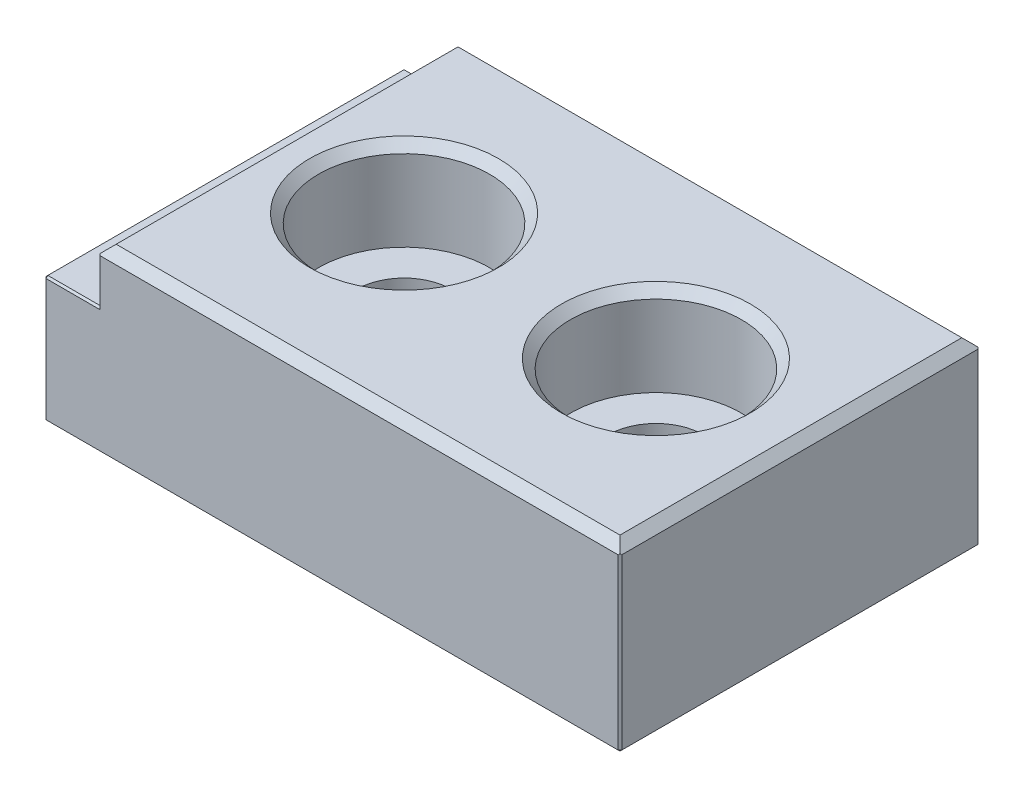
ISO-10303-21;
HEADER;
FILE_DESCRIPTION(('STEP AP214'),'2;1');
FILE_NAME('part.step','',(''),(''),'','','');
FILE_SCHEMA(('AUTOMOTIVE_DESIGN { 1 0 10303 214 1 1 1 1 }'));
ENDSEC;
DATA;
#1=APPLICATION_CONTEXT('core data for automotive mechanical design processes');
#2=APPLICATION_PROTOCOL_DEFINITION('international standard','automotive_design',2000,#1);
#3=PRODUCT_CONTEXT('',#1,'mechanical');
#4=PRODUCT('Part','Part','',(#3));
#5=PRODUCT_RELATED_PRODUCT_CATEGORY('part','',(#4));
#6=PRODUCT_DEFINITION_FORMATION('','',#4);
#7=PRODUCT_DEFINITION_CONTEXT('part definition',#1,'design');
#8=PRODUCT_DEFINITION('design','',#6,#7);
#9=PRODUCT_DEFINITION_SHAPE('','',#8);
#10=(LENGTH_UNIT() NAMED_UNIT(*) SI_UNIT(.MILLI.,.METRE.));
#11=(NAMED_UNIT(*) PLANE_ANGLE_UNIT() SI_UNIT($,.RADIAN.));
#12=(NAMED_UNIT(*) SI_UNIT($,.STERADIAN.) SOLID_ANGLE_UNIT());
#13=UNCERTAINTY_MEASURE_WITH_UNIT(LENGTH_MEASURE(1.E-05),#10,'distance_accuracy_value','');
#14=(GEOMETRIC_REPRESENTATION_CONTEXT(3) GLOBAL_UNCERTAINTY_ASSIGNED_CONTEXT((#13)) GLOBAL_UNIT_ASSIGNED_CONTEXT((#10,
#11,#12)) REPRESENTATION_CONTEXT('',''));
#15=CARTESIAN_POINT('',(0.,0.,0.));
#16=DIRECTION('',(0.,0.,1.));
#17=DIRECTION('',(1.,0.,0.));
#18=AXIS2_PLACEMENT_3D('',#15,#16,#17);
#19=CARTESIAN_POINT('',(0.,10.,0.));
#20=DIRECTION('',(0.,1.,0.));
#21=DIRECTION('',(0.,0.,1.));
#22=AXIS2_PLACEMENT_3D('',#19,#20,#21);
#23=PLANE('',#22);
#24=CARTESIAN_POINT('',(9.86640835579515,10.,-4.24999999999999));
#25=DIRECTION('',(0.,1.,0.));
#26=DIRECTION('',(0.,0.,1.));
#27=AXIS2_PLACEMENT_3D('',#24,#25,#26);
#28=CIRCLE('',#27,5.25000000000001);
#29=CARTESIAN_POINT('',(9.86640835579515,10.,1.00000000000002));
#30=VERTEX_POINT('',#29);
#31=EDGE_CURVE('E203',#30,#30,#28,.F.);
#32=ORIENTED_EDGE('',*,*,#31,.T.);
#33=EDGE_LOOP('',(#32));
#34=FACE_BOUND('',#33,.T.);
#35=CARTESIAN_POINT('',(-4.13359164420485,10.,-4.24999999999999));
#36=DIRECTION('',(0.,1.,0.));
#37=DIRECTION('',(0.,0.,1.));
#38=AXIS2_PLACEMENT_3D('',#35,#36,#37);
#39=CIRCLE('',#38,5.25000000000001);
#40=CARTESIAN_POINT('',(-4.13359164420485,10.,1.00000000000002));
#41=VERTEX_POINT('',#40);
#42=EDGE_CURVE('E200',#41,#41,#39,.F.);
#43=ORIENTED_EDGE('',*,*,#42,.T.);
#44=EDGE_LOOP('',(#43));
#45=FACE_BOUND('',#44,.T.);
#46=DIRECTION('',(-1.,0.,0.));
#47=VECTOR('',#46,1.);
#48=CARTESIAN_POINT('',(-11.1335916442048,10.,-13.75));
#49=LINE('',#48,#47);
#50=CARTESIAN_POINT('',(17.3664083557951,10.,-13.75));
#51=VERTEX_POINT('',#50);
#52=CARTESIAN_POINT('',(-10.6335916442048,10.,-13.75));
#53=VERTEX_POINT('',#52);
#54=EDGE_CURVE('E168',#51,#53,#49,.T.);
#55=ORIENTED_EDGE('',*,*,#54,.T.);
#56=DIRECTION('',(0.,0.,1.));
#57=VECTOR('',#56,1.);
#58=CARTESIAN_POINT('',(-10.6335916442048,10.,5.75000000000001));
#59=LINE('',#58,#57);
#60=CARTESIAN_POINT('',(-10.6335916442048,10.,5.25));
#61=VERTEX_POINT('',#60);
#62=EDGE_CURVE('E198',#53,#61,#59,.T.);
#63=ORIENTED_EDGE('',*,*,#62,.T.);
#64=DIRECTION('',(1.,0.,0.));
#65=VECTOR('',#64,1.);
#66=CARTESIAN_POINT('',(17.8664083557952,10.,5.25));
#67=LINE('',#66,#65);
#68=CARTESIAN_POINT('',(17.3664083557952,10.,5.25));
#69=VERTEX_POINT('',#68);
#70=EDGE_CURVE('E171',#61,#69,#67,.T.);
#71=ORIENTED_EDGE('',*,*,#70,.T.);
#72=DIRECTION('',(0.,0.,-1.));
#73=VECTOR('',#72,1.);
#74=CARTESIAN_POINT('',(17.3664083557951,10.,-14.25));
#75=LINE('',#74,#73);
#76=EDGE_CURVE('E164',#69,#51,#75,.T.);
#77=ORIENTED_EDGE('',*,*,#76,.T.);
#78=EDGE_LOOP('',(#55,#63,#71,#77));
#79=FACE_BOUND('',#78,.T.);
#80=ADVANCED_FACE('F33',(#34,#45,#79),#23,.T.);
#81=CARTESIAN_POINT('',(0.,0.,0.));
#82=DIRECTION('',(0.,1.,0.));
#83=DIRECTION('',(0.,0.,1.));
#84=AXIS2_PLACEMENT_3D('',#81,#82,#83);
#85=PLANE('',#84);
#86=CARTESIAN_POINT('',(-4.13359164420485,0.,-4.24999999999999));
#87=DIRECTION('',(0.,1.,0.));
#88=DIRECTION('',(0.,0.,1.));
#89=AXIS2_PLACEMENT_3D('',#86,#87,#88);
#90=CIRCLE('',#89,2.74999999999999);
#91=CARTESIAN_POINT('',(-4.13359164420485,0.,-1.5));
#92=VERTEX_POINT('',#91);
#93=EDGE_CURVE('E236',#92,#92,#90,.T.);
#94=ORIENTED_EDGE('',*,*,#93,.T.);
#95=EDGE_LOOP('',(#94));
#96=FACE_BOUND('',#95,.T.);
#97=CARTESIAN_POINT('',(9.86640835579515,0.,-4.24999999999999));
#98=DIRECTION('',(0.,1.,0.));
#99=DIRECTION('',(0.,0.,1.));
#100=AXIS2_PLACEMENT_3D('',#97,#98,#99);
#101=CIRCLE('',#100,2.74999999999999);
#102=CARTESIAN_POINT('',(9.86640835579515,0.,-1.5));
#103=VERTEX_POINT('',#102);
#104=EDGE_CURVE('E233',#103,#103,#101,.T.);
#105=ORIENTED_EDGE('',*,*,#104,.T.);
#106=EDGE_LOOP('',(#105));
#107=FACE_BOUND('',#106,.T.);
#108=DIRECTION('',(0.,0.,1.));
#109=VECTOR('',#108,1.);
#110=CARTESIAN_POINT('',(17.7664083557951,0.,0.));
#111=LINE('',#110,#109);
#112=CARTESIAN_POINT('',(17.7664083557951,0.,-14.15));
#113=VERTEX_POINT('',#112);
#114=CARTESIAN_POINT('',(17.7664083557952,0.,5.65000000000001));
#115=VERTEX_POINT('',#114);
#116=EDGE_CURVE('E220',#113,#115,#111,.T.);
#117=ORIENTED_EDGE('',*,*,#116,.T.);
#118=DIRECTION('',(-1.,0.,0.));
#119=VECTOR('',#118,1.);
#120=CARTESIAN_POINT('',(0.,0.,5.65000000000001));
#121=LINE('',#120,#119);
#122=CARTESIAN_POINT('',(-14.0335916442048,0.,5.65000000000001));
#123=VERTEX_POINT('',#122);
#124=EDGE_CURVE('E230',#115,#123,#121,.T.);
#125=ORIENTED_EDGE('',*,*,#124,.T.);
#126=DIRECTION('',(0.,0.,-1.));
#127=VECTOR('',#126,1.);
#128=CARTESIAN_POINT('',(-14.0335916442048,0.,0.));
#129=LINE('',#128,#127);
#130=CARTESIAN_POINT('',(-14.0335916442048,0.,-14.15));
#131=VERTEX_POINT('',#130);
#132=EDGE_CURVE('E228',#123,#131,#129,.T.);
#133=ORIENTED_EDGE('',*,*,#132,.T.);
#134=DIRECTION('',(1.,0.,0.));
#135=VECTOR('',#134,1.);
#136=CARTESIAN_POINT('',(0.,0.,-14.15));
#137=LINE('',#136,#135);
#138=EDGE_CURVE('E226',#131,#113,#137,.T.);
#139=ORIENTED_EDGE('',*,*,#138,.T.);
#140=EDGE_LOOP('',(#117,#125,#133,#139));
#141=FACE_BOUND('',#140,.T.);
#142=ADVANCED_FACE('F442',(#96,#107,#141),#85,.F.);
#143=CARTESIAN_POINT('',(-14.1335916442049,10.,-14.25));
#144=DIRECTION('',(1.,0.,0.));
#145=DIRECTION('',(0.,0.,-1.));
#146=AXIS2_PLACEMENT_3D('',#143,#144,#145);
#147=PLANE('',#146);
#148=DIRECTION('',(0.,0.,1.));
#149=VECTOR('',#148,1.);
#150=CARTESIAN_POINT('',(-14.1335916442049,0.100000000000003,-14.25));
#151=LINE('',#150,#149);
#152=CARTESIAN_POINT('',(-14.1335916442049,0.100000000000003,-14.15));
#153=VERTEX_POINT('',#152);
#154=CARTESIAN_POINT('',(-14.1335916442048,0.100000000000003,5.65000000000001));
#155=VERTEX_POINT('',#154);
#156=EDGE_CURVE('E272',#153,#155,#151,.T.);
#157=ORIENTED_EDGE('',*,*,#156,.T.);
#158=DIRECTION('',(0.,1.,0.));
#159=VECTOR('',#158,1.);
#160=CARTESIAN_POINT('',(-14.1335916442048,10.,5.65000000000001));
#161=LINE('',#160,#159);
#162=CARTESIAN_POINT('',(-14.1335916442048,6.9,5.65000000000001));
#163=VERTEX_POINT('',#162);
#164=EDGE_CURVE('E274',#155,#163,#161,.T.);
#165=ORIENTED_EDGE('',*,*,#164,.T.);
#166=DIRECTION('',(0.,0.,-1.));
#167=VECTOR('',#166,1.);
#168=CARTESIAN_POINT('',(-14.1335916442049,6.9,-14.25));
#169=LINE('',#168,#167);
#170=CARTESIAN_POINT('',(-14.1335916442049,6.9,-14.15));
#171=VERTEX_POINT('',#170);
#172=EDGE_CURVE('E270',#163,#171,#169,.T.);
#173=ORIENTED_EDGE('',*,*,#172,.T.);
#174=DIRECTION('',(0.,-1.,0.));
#175=VECTOR('',#174,1.);
#176=CARTESIAN_POINT('',(-14.1335916442049,10.,-14.15));
#177=LINE('',#176,#175);
#178=EDGE_CURVE('E268',#171,#153,#177,.T.);
#179=ORIENTED_EDGE('',*,*,#178,.T.);
#180=EDGE_LOOP('',(#157,#165,#173,#179));
#181=FACE_BOUND('',#180,.T.);
#182=ADVANCED_FACE('F449',(#181),#147,.F.);
#183=CARTESIAN_POINT('',(-14.1335916442048,10.,5.75000000000001));
#184=DIRECTION('',(0.,0.,-1.));
#185=DIRECTION('',(-1.,0.,0.));
#186=AXIS2_PLACEMENT_3D('',#183,#184,#185);
#187=PLANE('',#186);
#188=DIRECTION('',(-1.,0.,0.));
#189=VECTOR('',#188,1.);
#190=CARTESIAN_POINT('',(-11.1335916442048,9.49999999999999,5.75000000000001));
#191=LINE('',#190,#189);
#192=CARTESIAN_POINT('',(17.7664083557952,9.49999999999999,5.75000000000001));
#193=VERTEX_POINT('',#192);
#194=CARTESIAN_POINT('',(-11.0335916442048,9.49999999999999,5.75000000000001));
#195=VERTEX_POINT('',#194);
#196=EDGE_CURVE('E212',#193,#195,#191,.T.);
#197=ORIENTED_EDGE('',*,*,#196,.T.);
#198=DIRECTION('',(0.,-1.,0.));
#199=VECTOR('',#198,1.);
#200=CARTESIAN_POINT('',(-11.0335916442048,10.,5.75000000000001));
#201=LINE('',#200,#199);
#202=CARTESIAN_POINT('',(-11.0335916442048,6.9,5.75000000000001));
#203=VERTEX_POINT('',#202);
#204=EDGE_CURVE('E254',#195,#203,#201,.T.);
#205=ORIENTED_EDGE('',*,*,#204,.T.);
#206=DIRECTION('',(-1.,0.,0.));
#207=VECTOR('',#206,1.);
#208=CARTESIAN_POINT('',(-14.1335916442048,6.9,5.75000000000001));
#209=LINE('',#208,#207);
#210=CARTESIAN_POINT('',(-14.0335916442048,6.9,5.75000000000001));
#211=VERTEX_POINT('',#210);
#212=EDGE_CURVE('E252',#203,#211,#209,.T.);
#213=ORIENTED_EDGE('',*,*,#212,.T.);
#214=DIRECTION('',(0.,-1.,0.));
#215=VECTOR('',#214,1.);
#216=CARTESIAN_POINT('',(-14.0335916442048,10.,5.75000000000001));
#217=LINE('',#216,#215);
#218=CARTESIAN_POINT('',(-14.0335916442048,0.100000000000003,5.75000000000001));
#219=VERTEX_POINT('',#218);
#220=EDGE_CURVE('E250',#211,#219,#217,.T.);
#221=ORIENTED_EDGE('',*,*,#220,.T.);
#222=DIRECTION('',(1.,0.,0.));
#223=VECTOR('',#222,1.);
#224=CARTESIAN_POINT('',(-14.1335916442048,0.100000000000003,5.75000000000001));
#225=LINE('',#224,#223);
#226=CARTESIAN_POINT('',(17.7664083557952,0.100000000000003,5.75000000000001));
#227=VERTEX_POINT('',#226);
#228=EDGE_CURVE('E247',#219,#227,#225,.T.);
#229=ORIENTED_EDGE('',*,*,#228,.T.);
#230=DIRECTION('',(0.,1.,0.));
#231=VECTOR('',#230,1.);
#232=CARTESIAN_POINT('',(17.7664083557952,10.,5.75000000000001));
#233=LINE('',#232,#231);
#234=EDGE_CURVE('E245',#227,#193,#233,.T.);
#235=ORIENTED_EDGE('',*,*,#234,.T.);
#236=EDGE_LOOP('',(#197,#205,#213,#221,#229,#235));
#237=FACE_BOUND('',#236,.T.);
#238=ADVANCED_FACE('F486',(#237),#187,.F.);
#239=CARTESIAN_POINT('',(17.8664083557952,10.,-14.25));
#240=DIRECTION('',(-1.,0.,0.));
#241=DIRECTION('',(0.,0.,1.));
#242=AXIS2_PLACEMENT_3D('',#239,#240,#241);
#243=PLANE('',#242);
#244=DIRECTION('',(0.,0.,1.));
#245=VECTOR('',#244,1.);
#246=CARTESIAN_POINT('',(17.8664083557952,9.49999999999999,5.75000000000001));
#247=LINE('',#246,#245);
#248=CARTESIAN_POINT('',(17.8664083557952,9.49999999999999,-14.15));
#249=VERTEX_POINT('',#248);
#250=CARTESIAN_POINT('',(17.8664083557952,9.49999999999999,5.65000000000001));
#251=VERTEX_POINT('',#250);
#252=EDGE_CURVE('E215',#249,#251,#247,.T.);
#253=ORIENTED_EDGE('',*,*,#252,.T.);
#254=DIRECTION('',(0.,-1.,0.));
#255=VECTOR('',#254,1.);
#256=CARTESIAN_POINT('',(17.8664083557952,10.,5.65000000000001));
#257=LINE('',#256,#255);
#258=CARTESIAN_POINT('',(17.8664083557952,0.100000000000003,5.65000000000001));
#259=VERTEX_POINT('',#258);
#260=EDGE_CURVE('E50',#251,#259,#257,.T.);
#261=ORIENTED_EDGE('',*,*,#260,.T.);
#262=DIRECTION('',(0.,0.,-1.));
#263=VECTOR('',#262,1.);
#264=CARTESIAN_POINT('',(17.8664083557952,0.100000000000003,-14.25));
#265=LINE('',#264,#263);
#266=CARTESIAN_POINT('',(17.8664083557952,0.100000000000003,-14.15));
#267=VERTEX_POINT('',#266);
#268=EDGE_CURVE('E54',#259,#267,#265,.T.);
#269=ORIENTED_EDGE('',*,*,#268,.T.);
#270=DIRECTION('',(0.,1.,0.));
#271=VECTOR('',#270,1.);
#272=CARTESIAN_POINT('',(17.8664083557952,10.,-14.15));
#273=LINE('',#272,#271);
#274=EDGE_CURVE('E297',#267,#249,#273,.T.);
#275=ORIENTED_EDGE('',*,*,#274,.T.);
#276=EDGE_LOOP('',(#253,#261,#269,#275));
#277=FACE_BOUND('',#276,.T.);
#278=ADVANCED_FACE('F483',(#277),#243,.F.);
#279=CARTESIAN_POINT('',(-14.1335916442049,10.,-14.25));
#280=DIRECTION('',(0.,0.,1.));
#281=DIRECTION('',(1.,0.,0.));
#282=AXIS2_PLACEMENT_3D('',#279,#280,#281);
#283=PLANE('',#282);
#284=DIRECTION('',(1.,0.,0.));
#285=VECTOR('',#284,1.);
#286=CARTESIAN_POINT('',(-14.1335916442049,6.9,-14.25));
#287=LINE('',#286,#285);
#288=CARTESIAN_POINT('',(-14.0335916442048,6.9,-14.25));
#289=VERTEX_POINT('',#288);
#290=CARTESIAN_POINT('',(-11.0335916442048,6.9,-14.25));
#291=VERTEX_POINT('',#290);
#292=EDGE_CURVE('E289',#289,#291,#287,.T.);
#293=ORIENTED_EDGE('',*,*,#292,.T.);
#294=DIRECTION('',(0.,1.,0.));
#295=VECTOR('',#294,1.);
#296=CARTESIAN_POINT('',(-11.0335916442048,10.,-14.25));
#297=LINE('',#296,#295);
#298=CARTESIAN_POINT('',(-11.0335916442048,9.49999999999999,-14.25));
#299=VERTEX_POINT('',#298);
#300=EDGE_CURVE('E291',#291,#299,#297,.T.);
#301=ORIENTED_EDGE('',*,*,#300,.T.);
#302=DIRECTION('',(1.,0.,0.));
#303=VECTOR('',#302,1.);
#304=CARTESIAN_POINT('',(17.8664083557952,9.49999999999999,-14.25));
#305=LINE('',#304,#303);
#306=CARTESIAN_POINT('',(17.7664083557951,9.49999999999999,-14.25));
#307=VERTEX_POINT('',#306);
#308=EDGE_CURVE('E217',#299,#307,#305,.T.);
#309=ORIENTED_EDGE('',*,*,#308,.T.);
#310=DIRECTION('',(0.,-1.,0.));
#311=VECTOR('',#310,1.);
#312=CARTESIAN_POINT('',(17.7664083557951,10.,-14.25));
#313=LINE('',#312,#311);
#314=CARTESIAN_POINT('',(17.7664083557951,0.100000000000003,-14.25));
#315=VERTEX_POINT('',#314);
#316=EDGE_CURVE('E283',#307,#315,#313,.T.);
#317=ORIENTED_EDGE('',*,*,#316,.T.);
#318=DIRECTION('',(-1.,0.,0.));
#319=VECTOR('',#318,1.);
#320=CARTESIAN_POINT('',(-14.1335916442049,0.100000000000003,-14.25));
#321=LINE('',#320,#319);
#322=CARTESIAN_POINT('',(-14.0335916442048,0.100000000000003,-14.25));
#323=VERTEX_POINT('',#322);
#324=EDGE_CURVE('E285',#315,#323,#321,.T.);
#325=ORIENTED_EDGE('',*,*,#324,.T.);
#326=DIRECTION('',(0.,1.,0.));
#327=VECTOR('',#326,1.);
#328=CARTESIAN_POINT('',(-14.0335916442048,10.,-14.25));
#329=LINE('',#328,#327);
#330=EDGE_CURVE('E287',#323,#289,#329,.T.);
#331=ORIENTED_EDGE('',*,*,#330,.T.);
#332=EDGE_LOOP('',(#293,#301,#309,#317,#325,#331));
#333=FACE_BOUND('',#332,.T.);
#334=ADVANCED_FACE('F370',(#333),#283,.F.);
#335=CARTESIAN_POINT('',(9.86640835579515,10.,-4.24999999999999));
#336=DIRECTION('',(0.,1.,0.));
#337=DIRECTION('',(0.,0.,1.));
#338=AXIS2_PLACEMENT_3D('',#335,#336,#337);
#339=CYLINDRICAL_SURFACE('',#338,2.65);
#340=CARTESIAN_POINT('',(9.86640835579515,0.0999999999999925,-4.24999999999999));
#341=DIRECTION('',(0.,1.,0.));
#342=DIRECTION('',(0.,0.,1.));
#343=AXIS2_PLACEMENT_3D('',#340,#341,#342);
#344=CIRCLE('',#343,2.65);
#345=CARTESIAN_POINT('',(9.86640835579515,0.0999999999999925,-1.59999999999999));
#346=VERTEX_POINT('',#345);
#347=EDGE_CURVE('E242',#346,#346,#344,.F.);
#348=ORIENTED_EDGE('',*,*,#347,.T.);
#349=EDGE_LOOP('',(#348));
#350=FACE_BOUND('',#349,.T.);
#351=CARTESIAN_POINT('',(9.86640835579515,5.,-4.24999999999999));
#352=DIRECTION('',(0.,1.,0.));
#353=DIRECTION('',(0.,0.,1.));
#354=AXIS2_PLACEMENT_3D('',#351,#352,#353);
#355=CIRCLE('',#354,2.65);
#356=CARTESIAN_POINT('',(9.86640835579515,5.,-1.59999999999999));
#357=VERTEX_POINT('',#356);
#358=EDGE_CURVE('E193',#357,#357,#355,.T.);
#359=ORIENTED_EDGE('',*,*,#358,.T.);
#360=EDGE_LOOP('',(#359));
#361=FACE_BOUND('',#360,.T.);
#362=ADVANCED_FACE('F478',(#350,#361),#339,.F.);
#363=CARTESIAN_POINT('',(12.5164083557952,5.,-4.24999999999999));
#364=DIRECTION('',(0.,-1.,0.));
#365=DIRECTION('',(0.,0.,-1.));
#366=AXIS2_PLACEMENT_3D('',#363,#364,#365);
#367=PLANE('',#366);
#368=ORIENTED_EDGE('',*,*,#358,.F.);
#369=EDGE_LOOP('',(#368));
#370=FACE_BOUND('',#369,.T.);
#371=CARTESIAN_POINT('',(9.86640835579515,5.,-4.24999999999999));
#372=DIRECTION('',(0.,1.,0.));
#373=DIRECTION('',(0.,0.,1.));
#374=AXIS2_PLACEMENT_3D('',#371,#372,#373);
#375=CIRCLE('',#374,4.75);
#376=CARTESIAN_POINT('',(9.86640835579515,5.,0.500000000000009));
#377=VERTEX_POINT('',#376);
#378=EDGE_CURVE('E795',#377,#377,#375,.T.);
#379=ORIENTED_EDGE('',*,*,#378,.T.);
#380=EDGE_LOOP('',(#379));
#381=FACE_BOUND('',#380,.T.);
#382=ADVANCED_FACE('F736',(#370,#381),#367,.F.);
#383=CARTESIAN_POINT('',(9.86640835579515,10.,-4.24999999999999));
#384=DIRECTION('',(0.,1.,0.));
#385=DIRECTION('',(0.,0.,1.));
#386=AXIS2_PLACEMENT_3D('',#383,#384,#385);
#387=CYLINDRICAL_SURFACE('',#386,4.75);
#388=CARTESIAN_POINT('',(9.86640835579515,9.5,-4.24999999999999));
#389=DIRECTION('',(0.,1.,0.));
#390=DIRECTION('',(0.,0.,1.));
#391=AXIS2_PLACEMENT_3D('',#388,#389,#390);
#392=CIRCLE('',#391,4.75);
#393=CARTESIAN_POINT('',(9.86640835579515,9.5,0.50000000000001));
#394=VERTEX_POINT('',#393);
#395=EDGE_CURVE('E190',#394,#394,#392,.T.);
#396=ORIENTED_EDGE('',*,*,#395,.T.);
#397=EDGE_LOOP('',(#396));
#398=FACE_BOUND('',#397,.T.);
#399=ORIENTED_EDGE('',*,*,#378,.F.);
#400=EDGE_LOOP('',(#399));
#401=FACE_BOUND('',#400,.T.);
#402=ADVANCED_FACE('F728',(#398,#401),#387,.F.);
#403=CARTESIAN_POINT('',(-4.13359164420485,10.,-4.24999999999999));
#404=DIRECTION('',(0.,1.,0.));
#405=DIRECTION('',(0.,0.,1.));
#406=AXIS2_PLACEMENT_3D('',#403,#404,#405);
#407=CYLINDRICAL_SURFACE('',#406,2.65);
#408=CARTESIAN_POINT('',(-4.13359164420485,0.0999999999999925,-4.24999999999999));
#409=DIRECTION('',(0.,1.,0.));
#410=DIRECTION('',(0.,0.,1.));
#411=AXIS2_PLACEMENT_3D('',#408,#409,#410);
#412=CIRCLE('',#411,2.65);
#413=CARTESIAN_POINT('',(-4.13359164420485,0.0999999999999925,-1.59999999999999));
#414=VERTEX_POINT('',#413);
#415=EDGE_CURVE('E239',#414,#414,#412,.F.);
#416=ORIENTED_EDGE('',*,*,#415,.T.);
#417=EDGE_LOOP('',(#416));
#418=FACE_BOUND('',#417,.T.);
#419=CARTESIAN_POINT('',(-4.13359164420485,5.,-4.24999999999999));
#420=DIRECTION('',(0.,1.,0.));
#421=DIRECTION('',(0.,0.,1.));
#422=AXIS2_PLACEMENT_3D('',#419,#420,#421);
#423=CIRCLE('',#422,2.65);
#424=CARTESIAN_POINT('',(-4.13359164420485,5.,-1.59999999999999));
#425=VERTEX_POINT('',#424);
#426=EDGE_CURVE('E797',#425,#425,#423,.T.);
#427=ORIENTED_EDGE('',*,*,#426,.T.);
#428=EDGE_LOOP('',(#427));
#429=FACE_BOUND('',#428,.T.);
#430=ADVANCED_FACE('F718',(#418,#429),#407,.F.);
#431=CARTESIAN_POINT('',(-1.48359164420485,5.,-4.24999999999999));
#432=DIRECTION('',(0.,-1.,0.));
#433=DIRECTION('',(0.,0.,-1.));
#434=AXIS2_PLACEMENT_3D('',#431,#432,#433);
#435=PLANE('',#434);
#436=ORIENTED_EDGE('',*,*,#426,.F.);
#437=EDGE_LOOP('',(#436));
#438=FACE_BOUND('',#437,.T.);
#439=CARTESIAN_POINT('',(-4.13359164420485,5.,-4.24999999999999));
#440=DIRECTION('',(0.,1.,0.));
#441=DIRECTION('',(0.,0.,1.));
#442=AXIS2_PLACEMENT_3D('',#439,#440,#441);
#443=CIRCLE('',#442,4.75);
#444=CARTESIAN_POINT('',(-4.13359164420485,5.,0.500000000000009));
#445=VERTEX_POINT('',#444);
#446=EDGE_CURVE('E802',#445,#445,#443,.T.);
#447=ORIENTED_EDGE('',*,*,#446,.T.);
#448=EDGE_LOOP('',(#447));
#449=FACE_BOUND('',#448,.T.);
#450=ADVANCED_FACE('F710',(#438,#449),#435,.F.);
#451=CARTESIAN_POINT('',(-4.13359164420485,10.,-4.24999999999999));
#452=DIRECTION('',(0.,1.,0.));
#453=DIRECTION('',(0.,0.,1.));
#454=AXIS2_PLACEMENT_3D('',#451,#452,#453);
#455=CYLINDRICAL_SURFACE('',#454,4.75);
#456=CARTESIAN_POINT('',(-4.13359164420485,9.5,-4.24999999999999));
#457=DIRECTION('',(0.,1.,0.));
#458=DIRECTION('',(0.,0.,1.));
#459=AXIS2_PLACEMENT_3D('',#456,#457,#458);
#460=CIRCLE('',#459,4.75);
#461=CARTESIAN_POINT('',(-4.13359164420485,9.5,0.50000000000001));
#462=VERTEX_POINT('',#461);
#463=EDGE_CURVE('E206',#462,#462,#460,.T.);
#464=ORIENTED_EDGE('',*,*,#463,.T.);
#465=EDGE_LOOP('',(#464));
#466=FACE_BOUND('',#465,.T.);
#467=ORIENTED_EDGE('',*,*,#446,.F.);
#468=EDGE_LOOP('',(#467));
#469=FACE_BOUND('',#468,.T.);
#470=ADVANCED_FACE('F703',(#466,#469),#455,.F.);
#471=CARTESIAN_POINT('',(-11.1335916442048,7.,5.75000000000001));
#472=DIRECTION('',(1.,0.,0.));
#473=DIRECTION('',(0.,0.,-1.));
#474=AXIS2_PLACEMENT_3D('',#471,#472,#473);
#475=PLANE('',#474);
#476=DIRECTION('',(0.,0.,-1.));
#477=VECTOR('',#476,1.);
#478=CARTESIAN_POINT('',(-11.1335916442048,7.,5.75000000000001));
#479=LINE('',#478,#477);
#480=CARTESIAN_POINT('',(-11.1335916442048,7.,5.65000000000001));
#481=VERTEX_POINT('',#480);
#482=CARTESIAN_POINT('',(-11.1335916442048,7.,-14.15));
#483=VERTEX_POINT('',#482);
#484=EDGE_CURVE('E224',#481,#483,#479,.T.);
#485=ORIENTED_EDGE('',*,*,#484,.F.);
#486=DIRECTION('',(0.,1.,0.));
#487=VECTOR('',#486,1.);
#488=CARTESIAN_POINT('',(-11.1335916442048,7.,5.65000000000001));
#489=LINE('',#488,#487);
#490=CARTESIAN_POINT('',(-11.1335916442048,9.49999999999999,5.65000000000001));
#491=VERTEX_POINT('',#490);
#492=EDGE_CURVE('E258',#481,#491,#489,.T.);
#493=ORIENTED_EDGE('',*,*,#492,.T.);
#494=DIRECTION('',(0.,0.,-1.));
#495=VECTOR('',#494,1.);
#496=CARTESIAN_POINT('',(-11.1335916442048,9.49999999999999,-14.25));
#497=LINE('',#496,#495);
#498=CARTESIAN_POINT('',(-11.1335916442048,9.49999999999999,-14.15));
#499=VERTEX_POINT('',#498);
#500=EDGE_CURVE('E209',#491,#499,#497,.T.);
#501=ORIENTED_EDGE('',*,*,#500,.T.);
#502=DIRECTION('',(0.,-1.,0.));
#503=VECTOR('',#502,1.);
#504=CARTESIAN_POINT('',(-11.1335916442048,7.,-14.15));
#505=LINE('',#504,#503);
#506=EDGE_CURVE('E256',#499,#483,#505,.T.);
#507=ORIENTED_EDGE('',*,*,#506,.T.);
#508=EDGE_LOOP('',(#485,#493,#501,#507));
#509=FACE_BOUND('',#508,.T.);
#510=ADVANCED_FACE('F416',(#509),#475,.F.);
#511=CARTESIAN_POINT('',(0.,7.,0.));
#512=DIRECTION('',(0.,-1.,0.));
#513=DIRECTION('',(0.,0.,-1.));
#514=AXIS2_PLACEMENT_3D('',#511,#512,#513);
#515=PLANE('',#514);
#516=DIRECTION('',(0.,0.,1.));
#517=VECTOR('',#516,1.);
#518=CARTESIAN_POINT('',(-14.0335916442048,7.,0.));
#519=LINE('',#518,#517);
#520=CARTESIAN_POINT('',(-14.0335916442048,7.,-14.15));
#521=VERTEX_POINT('',#520);
#522=CARTESIAN_POINT('',(-14.0335916442048,7.,5.65000000000001));
#523=VERTEX_POINT('',#522);
#524=EDGE_CURVE('E279',#521,#523,#519,.T.);
#525=ORIENTED_EDGE('',*,*,#524,.T.);
#526=DIRECTION('',(1.,0.,0.));
#527=VECTOR('',#526,1.);
#528=CARTESIAN_POINT('',(0.,7.,5.65000000000001));
#529=LINE('',#528,#527);
#530=EDGE_CURVE('E281',#523,#481,#529,.T.);
#531=ORIENTED_EDGE('',*,*,#530,.T.);
#532=ORIENTED_EDGE('',*,*,#484,.T.);
#533=DIRECTION('',(-1.,0.,0.));
#534=VECTOR('',#533,1.);
#535=CARTESIAN_POINT('',(0.,7.,-14.15));
#536=LINE('',#535,#534);
#537=EDGE_CURVE('E277',#483,#521,#536,.T.);
#538=ORIENTED_EDGE('',*,*,#537,.T.);
#539=EDGE_LOOP('',(#525,#531,#532,#538));
#540=FACE_BOUND('',#539,.T.);
#541=ADVANCED_FACE('F399',(#540),#515,.F.);
#542=CARTESIAN_POINT('',(9.86640835579515,9.5,-4.24999999999999));
#543=DIRECTION('',(0.,1.,0.));
#544=DIRECTION('',(0.,0.,1.));
#545=AXIS2_PLACEMENT_3D('',#542,#543,#544);
#546=CONICAL_SURFACE('',#545,4.75,0.785398163397456);
#547=ORIENTED_EDGE('',*,*,#31,.F.);
#548=EDGE_LOOP('',(#547));
#549=FACE_BOUND('',#548,.T.);
#550=ORIENTED_EDGE('',*,*,#395,.F.);
#551=EDGE_LOOP('',(#550));
#552=FACE_BOUND('',#551,.T.);
#553=ADVANCED_FACE('F492',(#549,#552),#546,.F.);
#554=CARTESIAN_POINT('',(-4.13359164420485,9.5,-4.24999999999999));
#555=DIRECTION('',(0.,1.,0.));
#556=DIRECTION('',(0.,0.,1.));
#557=AXIS2_PLACEMENT_3D('',#554,#555,#556);
#558=CONICAL_SURFACE('',#557,4.75,0.785398163397456);
#559=ORIENTED_EDGE('',*,*,#42,.F.);
#560=EDGE_LOOP('',(#559));
#561=FACE_BOUND('',#560,.T.);
#562=ORIENTED_EDGE('',*,*,#463,.F.);
#563=EDGE_LOOP('',(#562));
#564=FACE_BOUND('',#563,.T.);
#565=ADVANCED_FACE('F495',(#561,#564),#558,.F.);
#566=CARTESIAN_POINT('',(17.3664083557951,10.,0.));
#567=DIRECTION('',(0.707106781186549,0.707106781186546,0.));
#568=DIRECTION('',(0.,0.,1.));
#569=AXIS2_PLACEMENT_3D('',#566,#567,#568);
#570=PLANE('',#569);
#571=DIRECTION('',(0.577350269189626,-0.577350269189628,0.577350269189624));
#572=VECTOR('',#571,1.);
#573=CARTESIAN_POINT('',(15.6164083557952,11.75,3.50000000000001));
#574=LINE('',#573,#572);
#575=CARTESIAN_POINT('',(17.8164083557952,9.54999999999999,5.70000000000001));
#576=VERTEX_POINT('',#575);
#577=EDGE_CURVE('E182',#576,#69,#574,.F.);
#578=ORIENTED_EDGE('',*,*,#577,.F.);
#579=DIRECTION('',(-0.577350269189625,0.577350269189628,0.577350269189625));
#580=VECTOR('',#579,1.);
#581=CARTESIAN_POINT('',(19.4164083557951,7.94999999999999,4.10000000000001));
#582=LINE('',#581,#580);
#583=EDGE_CURVE('E11',#576,#251,#582,.F.);
#584=ORIENTED_EDGE('',*,*,#583,.T.);
#585=ORIENTED_EDGE('',*,*,#252,.F.);
#586=DIRECTION('',(0.577350269189625,-0.577350269189627,0.577350269189625));
#587=VECTOR('',#586,1.);
#588=CARTESIAN_POINT('',(22.2497416891285,5.11666666666666,-9.76666666666668));
#589=LINE('',#588,#587);
#590=CARTESIAN_POINT('',(17.8164083557952,9.54999999999999,-14.2));
#591=VERTEX_POINT('',#590);
#592=EDGE_CURVE('E42',#249,#591,#589,.F.);
#593=ORIENTED_EDGE('',*,*,#592,.T.);
#594=DIRECTION('',(0.577350269189625,-0.577350269189628,-0.577350269189624));
#595=VECTOR('',#594,1.);
#596=CARTESIAN_POINT('',(11.5776055705301,15.7888027852651,-7.96119721473496));
#597=LINE('',#596,#595);
#598=EDGE_CURVE('E176',#51,#591,#597,.T.);
#599=ORIENTED_EDGE('',*,*,#598,.F.);
#600=ORIENTED_EDGE('',*,*,#76,.F.);
#601=EDGE_LOOP('',(#578,#584,#585,#593,#599,#600));
#602=FACE_BOUND('',#601,.T.);
#603=ADVANCED_FACE('F177',(#602),#570,.T.);
#604=CARTESIAN_POINT('',(0.,10.,5.25));
#605=DIRECTION('',(0.,0.707106781186545,0.70710678118655));
#606=DIRECTION('',(-1.,0.,0.));
#607=AXIS2_PLACEMENT_3D('',#604,#605,#606);
#608=PLANE('',#607);
#609=DIRECTION('',(-0.577350269189625,-0.577350269189629,0.577350269189625));
#610=VECTOR('',#609,1.);
#611=CARTESIAN_POINT('',(-7.08906109613658,13.5445305480683,1.70546945193174));
#612=LINE('',#611,#610);
#613=CARTESIAN_POINT('',(-11.0835916442048,9.54999999999999,5.70000000000001));
#614=VERTEX_POINT('',#613);
#615=EDGE_CURVE('E183',#614,#61,#612,.F.);
#616=ORIENTED_EDGE('',*,*,#615,.F.);
#617=DIRECTION('',(-0.577350269189625,0.577350269189628,-0.577350269189625));
#618=VECTOR('',#617,1.);
#619=CARTESIAN_POINT('',(-7.68906109613659,6.15546945193171,9.09453054806827));
#620=LINE('',#619,#618);
#621=EDGE_CURVE('E266',#614,#195,#620,.F.);
#622=ORIENTED_EDGE('',*,*,#621,.T.);
#623=ORIENTED_EDGE('',*,*,#196,.F.);
#624=DIRECTION('',(-0.577350269189625,-0.577350269189628,0.577350269189625));
#625=VECTOR('',#624,1.);
#626=CARTESIAN_POINT('',(12.1776055705301,3.91119721473493,11.338802785265));
#627=LINE('',#626,#625);
#628=EDGE_CURVE('E264',#193,#576,#627,.F.);
#629=ORIENTED_EDGE('',*,*,#628,.T.);
#630=ORIENTED_EDGE('',*,*,#577,.T.);
#631=ORIENTED_EDGE('',*,*,#70,.F.);
#632=EDGE_LOOP('',(#616,#622,#623,#629,#630,#631));
#633=FACE_BOUND('',#632,.T.);
#634=ADVANCED_FACE('F421',(#633),#608,.T.);
#635=CARTESIAN_POINT('',(0.,10.,-13.75));
#636=DIRECTION('',(0.,0.707106781186545,-0.70710678118655));
#637=DIRECTION('',(1.,0.,0.));
#638=AXIS2_PLACEMENT_3D('',#635,#636,#637);
#639=PLANE('',#638);
#640=ORIENTED_EDGE('',*,*,#308,.F.);
#641=DIRECTION('',(0.577350269189625,-0.577350269189628,-0.577350269189625));
#642=VECTOR('',#641,1.);
#643=CARTESIAN_POINT('',(-7.68906109613659,6.15546945193171,-17.5945305480682));
#644=LINE('',#643,#642);
#645=CARTESIAN_POINT('',(-11.0835916442048,9.54999999999999,-14.2));
#646=VERTEX_POINT('',#645);
#647=EDGE_CURVE('E295',#299,#646,#644,.F.);
#648=ORIENTED_EDGE('',*,*,#647,.T.);
#649=DIRECTION('',(0.577350269189625,0.577350269189629,0.577350269189625));
#650=VECTOR('',#649,1.);
#651=CARTESIAN_POINT('',(-7.08906109613658,13.5445305480683,-10.2054694519317));
#652=LINE('',#651,#650);
#653=EDGE_CURVE('E189',#53,#646,#652,.F.);
#654=ORIENTED_EDGE('',*,*,#653,.F.);
#655=ORIENTED_EDGE('',*,*,#54,.F.);
#656=ORIENTED_EDGE('',*,*,#598,.T.);
#657=DIRECTION('',(0.577350269189625,0.577350269189628,0.577350269189625));
#658=VECTOR('',#657,1.);
#659=CARTESIAN_POINT('',(12.1776055705301,3.91119721473493,-19.838802785265));
#660=LINE('',#659,#658);
#661=EDGE_CURVE('E293',#591,#307,#660,.F.);
#662=ORIENTED_EDGE('',*,*,#661,.T.);
#663=EDGE_LOOP('',(#640,#648,#654,#655,#656,#662));
#664=FACE_BOUND('',#663,.T.);
#665=ADVANCED_FACE('F187',(#664),#639,.T.);
#666=CARTESIAN_POINT('',(-11.1335916442048,9.49999999999999,5.75000000000001));
#667=DIRECTION('',(-0.70710678118655,0.707106781186545,0.));
#668=DIRECTION('',(0.,0.,1.));
#669=AXIS2_PLACEMENT_3D('',#666,#667,#668);
#670=PLANE('',#669);
#671=ORIENTED_EDGE('',*,*,#500,.F.);
#672=DIRECTION('',(-0.577350269189625,-0.577350269189628,-0.577350269189625));
#673=VECTOR('',#672,1.);
#674=CARTESIAN_POINT('',(-11.1002583108715,9.53333333333332,5.68333333333334));
#675=LINE('',#674,#673);
#676=EDGE_CURVE('E262',#491,#614,#675,.F.);
#677=ORIENTED_EDGE('',*,*,#676,.T.);
#678=ORIENTED_EDGE('',*,*,#615,.T.);
#679=ORIENTED_EDGE('',*,*,#62,.F.);
#680=ORIENTED_EDGE('',*,*,#653,.T.);
#681=DIRECTION('',(0.577350269189625,0.577350269189628,-0.577350269189625));
#682=VECTOR('',#681,1.);
#683=CARTESIAN_POINT('',(-17.7669249775381,2.86666666666664,-7.51666666666669));
#684=LINE('',#683,#682);
#685=EDGE_CURVE('E260',#646,#499,#684,.F.);
#686=ORIENTED_EDGE('',*,*,#685,.T.);
#687=EDGE_LOOP('',(#671,#677,#678,#679,#680,#686));
#688=FACE_BOUND('',#687,.T.);
#689=ADVANCED_FACE('F418',(#688),#670,.T.);
#690=CARTESIAN_POINT('',(-4.13359164420485,0.,-4.24999999999999));
#691=DIRECTION('',(0.,-1.,0.));
#692=DIRECTION('',(0.,0.,-1.));
#693=AXIS2_PLACEMENT_3D('',#690,#691,#692);
#694=CONICAL_SURFACE('',#693,2.74999999999999,0.78539816339744);
#695=ORIENTED_EDGE('',*,*,#415,.F.);
#696=EDGE_LOOP('',(#695));
#697=FACE_BOUND('',#696,.T.);
#698=ORIENTED_EDGE('',*,*,#93,.F.);
#699=EDGE_LOOP('',(#698));
#700=FACE_BOUND('',#699,.T.);
#701=ADVANCED_FACE('F502',(#697,#700),#694,.F.);
#702=CARTESIAN_POINT('',(9.86640835579515,0.,-4.24999999999999));
#703=DIRECTION('',(0.,-1.,0.));
#704=DIRECTION('',(0.,0.,-1.));
#705=AXIS2_PLACEMENT_3D('',#702,#703,#704);
#706=CONICAL_SURFACE('',#705,2.74999999999999,0.78539816339744);
#707=ORIENTED_EDGE('',*,*,#347,.F.);
#708=EDGE_LOOP('',(#707));
#709=FACE_BOUND('',#708,.T.);
#710=ORIENTED_EDGE('',*,*,#104,.F.);
#711=EDGE_LOOP('',(#710));
#712=FACE_BOUND('',#711,.T.);
#713=ADVANCED_FACE('F511',(#709,#712),#706,.F.);
#714=CARTESIAN_POINT('',(-11.0335916442048,10.,-14.25));
#715=DIRECTION('',(0.707106781186548,0.,0.707106781186548));
#716=DIRECTION('',(0.,1.,0.));
#717=AXIS2_PLACEMENT_3D('',#714,#715,#716);
#718=PLANE('',#717);
#719=ORIENTED_EDGE('',*,*,#647,.F.);
#720=ORIENTED_EDGE('',*,*,#300,.F.);
#721=DIRECTION('',(0.577350269189626,-0.577350269189626,-0.577350269189626));
#722=VECTOR('',#721,1.);
#723=CARTESIAN_POINT('',(-12.0669249775382,7.93333333333333,-13.2166666666667));
#724=LINE('',#723,#722);
#725=EDGE_CURVE('E37',#483,#291,#724,.T.);
#726=ORIENTED_EDGE('',*,*,#725,.F.);
#727=ORIENTED_EDGE('',*,*,#506,.F.);
#728=ORIENTED_EDGE('',*,*,#685,.F.);
#729=EDGE_LOOP('',(#719,#720,#726,#727,#728));
#730=FACE_BOUND('',#729,.T.);
#731=ADVANCED_FACE('F35',(#730),#718,.F.);
#732=CARTESIAN_POINT('',(0.,7.,-14.15));
#733=DIRECTION('',(0.,-0.707106781186548,0.707106781186548));
#734=DIRECTION('',(-1.,0.,0.));
#735=AXIS2_PLACEMENT_3D('',#732,#733,#734);
#736=PLANE('',#735);
#737=DIRECTION('',(0.,0.707106781186548,0.707106781186548));
#738=VECTOR('',#737,1.);
#739=CARTESIAN_POINT('',(-14.0335916442048,6.95,-14.2));
#740=LINE('',#739,#738);
#741=EDGE_CURVE('E352',#521,#289,#740,.F.);
#742=ORIENTED_EDGE('',*,*,#741,.F.);
#743=ORIENTED_EDGE('',*,*,#537,.F.);
#744=ORIENTED_EDGE('',*,*,#725,.T.);
#745=ORIENTED_EDGE('',*,*,#292,.F.);
#746=EDGE_LOOP('',(#742,#743,#744,#745));
#747=FACE_BOUND('',#746,.T.);
#748=ADVANCED_FACE('F363',(#747),#736,.F.);
#749=CARTESIAN_POINT('',(-14.1335916442049,6.9,-14.15));
#750=DIRECTION('',(-0.577350269189626,0.577350269189626,-0.577350269189626));
#751=DIRECTION('',(-0.707106781186547,0.,0.707106781186547));
#752=AXIS2_PLACEMENT_3D('',#749,#750,#751);
#753=PLANE('',#752);
#754=DIRECTION('',(-0.707106781186549,-0.707106781186546,0.));
#755=VECTOR('',#754,1.);
#756=CARTESIAN_POINT('',(-14.1335916442049,6.9,-14.15));
#757=LINE('',#756,#755);
#758=EDGE_CURVE('E347',#521,#171,#757,.T.);
#759=ORIENTED_EDGE('',*,*,#758,.F.);
#760=ORIENTED_EDGE('',*,*,#741,.T.);
#761=DIRECTION('',(0.707106781186548,0.,-0.707106781186548));
#762=VECTOR('',#761,1.);
#763=CARTESIAN_POINT('',(-14.1335916442049,6.9,-14.15));
#764=LINE('',#763,#762);
#765=EDGE_CURVE('E350',#171,#289,#764,.T.);
#766=ORIENTED_EDGE('',*,*,#765,.F.);
#767=EDGE_LOOP('',(#759,#760,#766));
#768=FACE_BOUND('',#767,.T.);
#769=ADVANCED_FACE('F391',(#768),#753,.T.);
#770=CARTESIAN_POINT('',(-11.1335916442048,7.,5.65000000000001));
#771=DIRECTION('',(0.707106781186548,0.,-0.707106781186548));
#772=DIRECTION('',(0.,1.,0.));
#773=AXIS2_PLACEMENT_3D('',#770,#771,#772);
#774=PLANE('',#773);
#775=ORIENTED_EDGE('',*,*,#676,.F.);
#776=ORIENTED_EDGE('',*,*,#492,.F.);
#777=DIRECTION('',(-0.577350269189626,0.577350269189626,-0.577350269189626));
#778=VECTOR('',#777,1.);
#779=CARTESIAN_POINT('',(-11.1335916442048,7.,5.65000000000001));
#780=LINE('',#779,#778);
#781=EDGE_CURVE('E344',#203,#481,#780,.T.);
#782=ORIENTED_EDGE('',*,*,#781,.F.);
#783=ORIENTED_EDGE('',*,*,#204,.F.);
#784=ORIENTED_EDGE('',*,*,#621,.F.);
#785=EDGE_LOOP('',(#775,#776,#782,#783,#784));
#786=FACE_BOUND('',#785,.T.);
#787=ADVANCED_FACE('F412',(#786),#774,.F.);
#788=CARTESIAN_POINT('',(-14.1335916442049,10.,-14.15));
#789=DIRECTION('',(0.707106781186548,0.,0.707106781186548));
#790=DIRECTION('',(0.,-1.,0.));
#791=AXIS2_PLACEMENT_3D('',#788,#789,#790);
#792=PLANE('',#791);
#793=ORIENTED_EDGE('',*,*,#765,.T.);
#794=ORIENTED_EDGE('',*,*,#330,.F.);
#795=DIRECTION('',(-0.707106781186548,0.,0.707106781186548));
#796=VECTOR('',#795,1.);
#797=CARTESIAN_POINT('',(-14.0835916442048,0.100000000000003,-14.2));
#798=LINE('',#797,#796);
#799=EDGE_CURVE('E338',#153,#323,#798,.F.);
#800=ORIENTED_EDGE('',*,*,#799,.F.);
#801=ORIENTED_EDGE('',*,*,#178,.F.);
#802=EDGE_LOOP('',(#793,#794,#800,#801));
#803=FACE_BOUND('',#802,.T.);
#804=ADVANCED_FACE('F390',(#803),#792,.F.);
#805=CARTESIAN_POINT('',(-14.0335916442048,7.,0.));
#806=DIRECTION('',(0.707106781186546,-0.707106781186549,0.));
#807=DIRECTION('',(0.,0.,1.));
#808=AXIS2_PLACEMENT_3D('',#805,#806,#807);
#809=PLANE('',#808);
#810=ORIENTED_EDGE('',*,*,#758,.T.);
#811=ORIENTED_EDGE('',*,*,#172,.F.);
#812=DIRECTION('',(0.707106781186549,0.707106781186546,0.));
#813=VECTOR('',#812,1.);
#814=CARTESIAN_POINT('',(-14.1335916442048,6.9,5.65000000000001));
#815=LINE('',#814,#813);
#816=EDGE_CURVE('E335',#523,#163,#815,.F.);
#817=ORIENTED_EDGE('',*,*,#816,.F.);
#818=ORIENTED_EDGE('',*,*,#524,.F.);
#819=EDGE_LOOP('',(#810,#811,#817,#818));
#820=FACE_BOUND('',#819,.T.);
#821=ADVANCED_FACE('F396',(#820),#809,.F.);
#822=CARTESIAN_POINT('',(0.,7.,5.65000000000001));
#823=DIRECTION('',(0.,-0.707106781186548,-0.707106781186548));
#824=DIRECTION('',(1.,0.,0.));
#825=AXIS2_PLACEMENT_3D('',#822,#823,#824);
#826=PLANE('',#825);
#827=ORIENTED_EDGE('',*,*,#781,.T.);
#828=ORIENTED_EDGE('',*,*,#530,.F.);
#829=DIRECTION('',(0.,-0.707106781186548,0.707106781186548));
#830=VECTOR('',#829,1.);
#831=CARTESIAN_POINT('',(-14.0335916442048,6.95,5.70000000000001));
#832=LINE('',#831,#830);
#833=EDGE_CURVE('E332',#211,#523,#832,.F.);
#834=ORIENTED_EDGE('',*,*,#833,.F.);
#835=ORIENTED_EDGE('',*,*,#212,.F.);
#836=EDGE_LOOP('',(#827,#828,#834,#835));
#837=FACE_BOUND('',#836,.T.);
#838=ADVANCED_FACE('F404',(#837),#826,.F.);
#839=CARTESIAN_POINT('',(17.7664083557951,10.,-14.25));
#840=DIRECTION('',(-0.707106781186548,0.,0.707106781186548));
#841=DIRECTION('',(0.,-1.,0.));
#842=AXIS2_PLACEMENT_3D('',#839,#840,#841);
#843=PLANE('',#842);
#844=ORIENTED_EDGE('',*,*,#592,.F.);
#845=ORIENTED_EDGE('',*,*,#274,.F.);
#846=DIRECTION('',(-0.707106781186548,0.,-0.707106781186548));
#847=VECTOR('',#846,1.);
#848=CARTESIAN_POINT('',(17.8164083557952,0.100000000000003,-14.2));
#849=LINE('',#848,#847);
#850=EDGE_CURVE('E329',#315,#267,#849,.F.);
#851=ORIENTED_EDGE('',*,*,#850,.F.);
#852=ORIENTED_EDGE('',*,*,#316,.F.);
#853=ORIENTED_EDGE('',*,*,#661,.F.);
#854=EDGE_LOOP('',(#844,#845,#851,#852,#853));
#855=FACE_BOUND('',#854,.T.);
#856=ADVANCED_FACE('F373',(#855),#843,.F.);
#857=CARTESIAN_POINT('',(-14.1335916442049,0.100000000000003,-14.25));
#858=DIRECTION('',(0.,0.707106781186548,0.707106781186548));
#859=DIRECTION('',(-1.,0.,0.));
#860=AXIS2_PLACEMENT_3D('',#857,#858,#859);
#861=PLANE('',#860);
#862=DIRECTION('',(0.,0.707106781186548,-0.707106781186548));
#863=VECTOR('',#862,1.);
#864=CARTESIAN_POINT('',(-14.0335916442048,0.,-14.15));
#865=LINE('',#864,#863);
#866=EDGE_CURVE('E341',#323,#131,#865,.F.);
#867=ORIENTED_EDGE('',*,*,#866,.F.);
#868=ORIENTED_EDGE('',*,*,#324,.F.);
#869=DIRECTION('',(0.,-0.707106781186548,0.707106781186548));
#870=VECTOR('',#869,1.);
#871=CARTESIAN_POINT('',(17.7664083557951,0.,-14.15));
#872=LINE('',#871,#870);
#873=EDGE_CURVE('E326',#113,#315,#872,.F.);
#874=ORIENTED_EDGE('',*,*,#873,.F.);
#875=ORIENTED_EDGE('',*,*,#138,.F.);
#876=EDGE_LOOP('',(#867,#868,#874,#875));
#877=FACE_BOUND('',#876,.T.);
#878=ADVANCED_FACE('F380',(#877),#861,.F.);
#879=CARTESIAN_POINT('',(-14.0335916442048,0.,-14.15));
#880=DIRECTION('',(-0.577350269189626,-0.577350269189626,-0.577350269189626));
#881=DIRECTION('',(-0.707106781186547,0.,0.707106781186547));
#882=AXIS2_PLACEMENT_3D('',#879,#880,#881);
#883=PLANE('',#882);
#884=ORIENTED_EDGE('',*,*,#799,.T.);
#885=ORIENTED_EDGE('',*,*,#866,.T.);
#886=DIRECTION('',(0.707106781186549,-0.707106781186546,0.));
#887=VECTOR('',#886,1.);
#888=CARTESIAN_POINT('',(-14.0335916442048,0.,-14.15));
#889=LINE('',#888,#887);
#890=EDGE_CURVE('E323',#153,#131,#889,.T.);
#891=ORIENTED_EDGE('',*,*,#890,.F.);
#892=EDGE_LOOP('',(#884,#885,#891));
#893=FACE_BOUND('',#892,.T.);
#894=ADVANCED_FACE('F386',(#893),#883,.T.);
#895=CARTESIAN_POINT('',(-14.1335916442048,6.9,5.65000000000001));
#896=DIRECTION('',(-0.577350269189626,0.577350269189626,0.577350269189626));
#897=DIRECTION('',(0.707106781186547,0.,0.707106781186547));
#898=AXIS2_PLACEMENT_3D('',#895,#896,#897);
#899=PLANE('',#898);
#900=ORIENTED_EDGE('',*,*,#833,.T.);
#901=ORIENTED_EDGE('',*,*,#816,.T.);
#902=DIRECTION('',(-0.707106781186548,0.,-0.707106781186548));
#903=VECTOR('',#902,1.);
#904=CARTESIAN_POINT('',(-14.1335916442048,6.9,5.65000000000001));
#905=LINE('',#904,#903);
#906=EDGE_CURVE('E321',#211,#163,#905,.T.);
#907=ORIENTED_EDGE('',*,*,#906,.F.);
#908=EDGE_LOOP('',(#900,#901,#907));
#909=FACE_BOUND('',#908,.T.);
#910=ADVANCED_FACE('F455',(#909),#899,.T.);
#911=CARTESIAN_POINT('',(17.7664083557951,0.,-14.15));
#912=DIRECTION('',(0.577350269189626,-0.577350269189626,-0.577350269189626));
#913=DIRECTION('',(-0.707106781186547,0.,-0.707106781186547));
#914=AXIS2_PLACEMENT_3D('',#911,#912,#913);
#915=PLANE('',#914);
#916=ORIENTED_EDGE('',*,*,#873,.T.);
#917=ORIENTED_EDGE('',*,*,#850,.T.);
#918=DIRECTION('',(0.707106781186553,0.707106781186542,0.));
#919=VECTOR('',#918,1.);
#920=CARTESIAN_POINT('',(17.7664083557951,0.,-14.15));
#921=LINE('',#920,#919);
#922=EDGE_CURVE('E318',#113,#267,#921,.T.);
#923=ORIENTED_EDGE('',*,*,#922,.F.);
#924=EDGE_LOOP('',(#916,#917,#923));
#925=FACE_BOUND('',#924,.T.);
#926=ADVANCED_FACE('F457',(#925),#915,.T.);
#927=CARTESIAN_POINT('',(-14.1335916442049,0.100000000000003,-14.25));
#928=DIRECTION('',(0.707106781186546,0.707106781186549,0.));
#929=DIRECTION('',(0.,0.,1.));
#930=AXIS2_PLACEMENT_3D('',#927,#928,#929);
#931=PLANE('',#930);
#932=ORIENTED_EDGE('',*,*,#890,.T.);
#933=ORIENTED_EDGE('',*,*,#132,.F.);
#934=DIRECTION('',(-0.707106781186549,0.707106781186546,0.));
#935=VECTOR('',#934,1.);
#936=CARTESIAN_POINT('',(-14.0335916442048,0.,5.65000000000001));
#937=LINE('',#936,#935);
#938=EDGE_CURVE('E315',#155,#123,#937,.F.);
#939=ORIENTED_EDGE('',*,*,#938,.F.);
#940=ORIENTED_EDGE('',*,*,#156,.F.);
#941=EDGE_LOOP('',(#932,#933,#939,#940));
#942=FACE_BOUND('',#941,.T.);
#943=ADVANCED_FACE('F446',(#942),#931,.F.);
#944=CARTESIAN_POINT('',(-14.0335916442048,10.,5.75000000000001));
#945=DIRECTION('',(0.707106781186548,0.,-0.707106781186548));
#946=DIRECTION('',(0.,-1.,0.));
#947=AXIS2_PLACEMENT_3D('',#944,#945,#946);
#948=PLANE('',#947);
#949=ORIENTED_EDGE('',*,*,#906,.T.);
#950=ORIENTED_EDGE('',*,*,#164,.F.);
#951=DIRECTION('',(0.707106781186548,0.,0.707106781186548));
#952=VECTOR('',#951,1.);
#953=CARTESIAN_POINT('',(-14.0835916442048,0.100000000000003,5.70000000000001));
#954=LINE('',#953,#952);
#955=EDGE_CURVE('E312',#219,#155,#954,.F.);
#956=ORIENTED_EDGE('',*,*,#955,.F.);
#957=ORIENTED_EDGE('',*,*,#220,.F.);
#958=EDGE_LOOP('',(#949,#950,#956,#957));
#959=FACE_BOUND('',#958,.T.);
#960=ADVANCED_FACE('F452',(#959),#948,.F.);
#961=CARTESIAN_POINT('',(17.8664083557952,10.,5.65000000000001));
#962=DIRECTION('',(-0.707106781186548,0.,-0.707106781186548));
#963=DIRECTION('',(0.,-1.,0.));
#964=AXIS2_PLACEMENT_3D('',#961,#962,#963);
#965=PLANE('',#964);
#966=ORIENTED_EDGE('',*,*,#628,.F.);
#967=ORIENTED_EDGE('',*,*,#234,.F.);
#968=DIRECTION('',(0.707106781186548,0.,-0.707106781186548));
#969=VECTOR('',#968,1.);
#970=CARTESIAN_POINT('',(17.7664083557952,0.100000000000003,5.75000000000001));
#971=LINE('',#970,#969);
#972=EDGE_CURVE('E309',#259,#227,#971,.F.);
#973=ORIENTED_EDGE('',*,*,#972,.F.);
#974=ORIENTED_EDGE('',*,*,#260,.F.);
#975=ORIENTED_EDGE('',*,*,#583,.F.);
#976=EDGE_LOOP('',(#966,#967,#973,#974,#975));
#977=FACE_BOUND('',#976,.T.);
#978=ADVANCED_FACE('F426',(#977),#965,.F.);
#979=CARTESIAN_POINT('',(17.8664083557952,0.100000000000003,-14.25));
#980=DIRECTION('',(-0.707106781186542,0.707106781186553,0.));
#981=DIRECTION('',(0.,0.,-1.));
#982=AXIS2_PLACEMENT_3D('',#979,#980,#981);
#983=PLANE('',#982);
#984=ORIENTED_EDGE('',*,*,#922,.T.);
#985=ORIENTED_EDGE('',*,*,#268,.F.);
#986=DIRECTION('',(-0.707106781186553,-0.707106781186542,0.));
#987=VECTOR('',#986,1.);
#988=CARTESIAN_POINT('',(17.8164083557952,0.0500000000000007,5.65000000000001));
#989=LINE('',#988,#987);
#990=EDGE_CURVE('E306',#115,#259,#989,.F.);
#991=ORIENTED_EDGE('',*,*,#990,.F.);
#992=ORIENTED_EDGE('',*,*,#116,.F.);
#993=EDGE_LOOP('',(#984,#985,#991,#992));
#994=FACE_BOUND('',#993,.T.);
#995=ADVANCED_FACE('F436',(#994),#983,.F.);
#996=CARTESIAN_POINT('',(-14.0335916442048,0.,5.65000000000001));
#997=DIRECTION('',(-0.577350269189626,-0.577350269189626,0.577350269189626));
#998=DIRECTION('',(0.707106781186547,0.,0.707106781186547));
#999=AXIS2_PLACEMENT_3D('',#996,#997,#998);
#1000=PLANE('',#999);
#1001=ORIENTED_EDGE('',*,*,#955,.T.);
#1002=ORIENTED_EDGE('',*,*,#938,.T.);
#1003=DIRECTION('',(0.,-0.707106781186548,-0.707106781186548));
#1004=VECTOR('',#1003,1.);
#1005=CARTESIAN_POINT('',(-14.0335916442048,0.,5.65000000000001));
#1006=LINE('',#1005,#1004);
#1007=EDGE_CURVE('E304',#219,#123,#1006,.T.);
#1008=ORIENTED_EDGE('',*,*,#1007,.F.);
#1009=EDGE_LOOP('',(#1001,#1002,#1008));
#1010=FACE_BOUND('',#1009,.T.);
#1011=ADVANCED_FACE('F520',(#1010),#1000,.T.);
#1012=CARTESIAN_POINT('',(17.7664083557952,0.100000000000003,5.75000000000001));
#1013=DIRECTION('',(0.577350269189626,-0.577350269189626,0.577350269189626));
#1014=DIRECTION('',(0.707106781186547,0.,-0.707106781186547));
#1015=AXIS2_PLACEMENT_3D('',#1012,#1013,#1014);
#1016=PLANE('',#1015);
#1017=ORIENTED_EDGE('',*,*,#990,.T.);
#1018=ORIENTED_EDGE('',*,*,#972,.T.);
#1019=DIRECTION('',(0.,0.707106781186548,0.707106781186548));
#1020=VECTOR('',#1019,1.);
#1021=CARTESIAN_POINT('',(17.7664083557952,0.100000000000003,5.75000000000001));
#1022=LINE('',#1021,#1020);
#1023=EDGE_CURVE('E302',#115,#227,#1022,.T.);
#1024=ORIENTED_EDGE('',*,*,#1023,.F.);
#1025=EDGE_LOOP('',(#1017,#1018,#1024));
#1026=FACE_BOUND('',#1025,.T.);
#1027=ADVANCED_FACE('F432',(#1026),#1016,.T.);
#1028=CARTESIAN_POINT('',(-14.1335916442048,0.100000000000003,5.75000000000001));
#1029=DIRECTION('',(0.,0.707106781186548,-0.707106781186548));
#1030=DIRECTION('',(1.,0.,0.));
#1031=AXIS2_PLACEMENT_3D('',#1028,#1029,#1030);
#1032=PLANE('',#1031);
#1033=ORIENTED_EDGE('',*,*,#1007,.T.);
#1034=ORIENTED_EDGE('',*,*,#124,.F.);
#1035=ORIENTED_EDGE('',*,*,#1023,.T.);
#1036=ORIENTED_EDGE('',*,*,#228,.F.);
#1037=EDGE_LOOP('',(#1033,#1034,#1035,#1036));
#1038=FACE_BOUND('',#1037,.T.);
#1039=ADVANCED_FACE('F438',(#1038),#1032,.F.);
#1040=CLOSED_SHELL('',(#80,#142,#182,#238,#278,#334,#362,#382,#402,#430,#450,#470,#510,#541,
#553,#565,#603,#634,#665,#689,#701,#713,#731,#748,#769,#787,#804,#821,#838,#856,#878,#894,#910,
#926,#943,#960,#978,#995,#1011,#1027,#1039));
#1041=MANIFOLD_SOLID_BREP('B2',#1040);
#1042=ADVANCED_BREP_SHAPE_REPRESENTATION('',(#18,#1041),#14);
#1043=SHAPE_DEFINITION_REPRESENTATION(#9,#1042);
ENDSEC;
END-ISO-10303-21;
